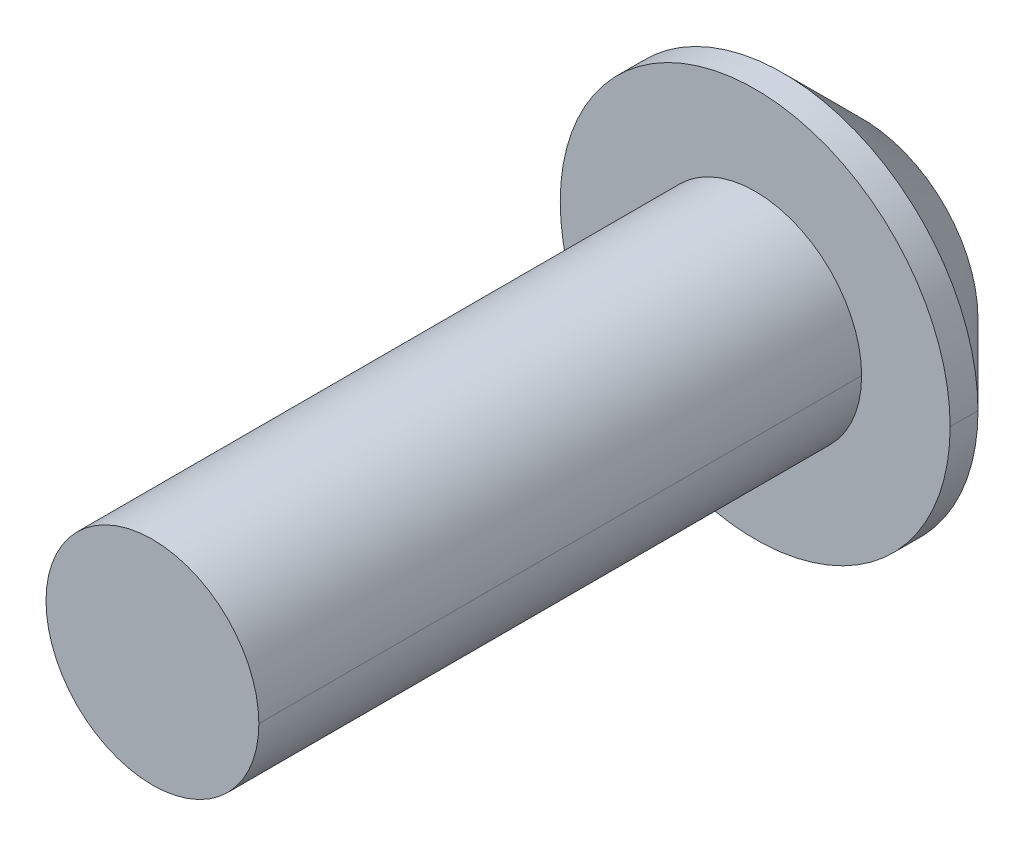
ISO-10303-21;
HEADER;
FILE_DESCRIPTION(('STEP AP214'),'2;1');
FILE_NAME('part.step','',(''),(''),'','','');
FILE_SCHEMA(('AUTOMOTIVE_DESIGN { 1 0 10303 214 1 1 1 1 }'));
ENDSEC;
DATA;
#1=APPLICATION_CONTEXT('core data for automotive mechanical design processes');
#2=APPLICATION_PROTOCOL_DEFINITION('international standard','automotive_design',2000,#1);
#3=PRODUCT_CONTEXT('',#1,'mechanical');
#4=PRODUCT('Part','Part','',(#3));
#5=PRODUCT_RELATED_PRODUCT_CATEGORY('part','',(#4));
#6=PRODUCT_DEFINITION_FORMATION('','',#4);
#7=PRODUCT_DEFINITION_CONTEXT('part definition',#1,'design');
#8=PRODUCT_DEFINITION('design','',#6,#7);
#9=PRODUCT_DEFINITION_SHAPE('','',#8);
#10=(LENGTH_UNIT() NAMED_UNIT(*) SI_UNIT(.MILLI.,.METRE.));
#11=(NAMED_UNIT(*) PLANE_ANGLE_UNIT() SI_UNIT($,.RADIAN.));
#12=(NAMED_UNIT(*) SI_UNIT($,.STERADIAN.) SOLID_ANGLE_UNIT());
#13=UNCERTAINTY_MEASURE_WITH_UNIT(LENGTH_MEASURE(1.E-05),#10,'distance_accuracy_value','');
#14=(GEOMETRIC_REPRESENTATION_CONTEXT(3) GLOBAL_UNCERTAINTY_ASSIGNED_CONTEXT((#13)) GLOBAL_UNIT_ASSIGNED_CONTEXT((#10,
#11,#12)) REPRESENTATION_CONTEXT('',''));
#15=CARTESIAN_POINT('',(0.,0.,0.));
#16=DIRECTION('',(0.,0.,1.));
#17=DIRECTION('',(1.,0.,0.));
#18=AXIS2_PLACEMENT_3D('',#15,#16,#17);
#19=CARTESIAN_POINT('',(0.,0.,9.15));
#20=DIRECTION('',(0.,0.,1.));
#21=DIRECTION('',(-1.,0.,0.));
#22=AXIS2_PLACEMENT_3D('',#19,#20,#21);
#23=CYLINDRICAL_SURFACE('',#22,5.35);
#24=DIRECTION('',(0.,0.,1.));
#25=VECTOR('',#24,1.);
#26=CARTESIAN_POINT('',(5.35,0.,9.15));
#27=LINE('',#26,#25);
#28=CARTESIAN_POINT('',(5.35,0.,-6.));
#29=VERTEX_POINT('',#28);
#30=CARTESIAN_POINT('',(5.35,0.,24.3));
#31=VERTEX_POINT('',#30);
#32=EDGE_CURVE('E114',#29,#31,#27,.T.);
#33=ORIENTED_EDGE('',*,*,#32,.F.);
#34=CARTESIAN_POINT('',(0.,0.,-6.));
#35=DIRECTION('',(0.,0.,1.));
#36=DIRECTION('',(-1.,0.,0.));
#37=AXIS2_PLACEMENT_3D('',#34,#35,#36);
#38=CIRCLE('',#37,5.35);
#39=CARTESIAN_POINT('',(-5.35,0.,-6.));
#40=VERTEX_POINT('',#39);
#41=EDGE_CURVE('E10',#29,#40,#38,.T.);
#42=ORIENTED_EDGE('',*,*,#41,.T.);
#43=DIRECTION('',(0.,0.,1.));
#44=VECTOR('',#43,1.);
#45=CARTESIAN_POINT('',(-5.35,0.,9.15));
#46=LINE('',#45,#44);
#47=CARTESIAN_POINT('',(-5.35,0.,24.3));
#48=VERTEX_POINT('',#47);
#49=EDGE_CURVE('E101',#40,#48,#46,.T.);
#50=ORIENTED_EDGE('',*,*,#49,.T.);
#51=CARTESIAN_POINT('',(0.,0.,24.3));
#52=DIRECTION('',(0.,0.,-1.));
#53=DIRECTION('',(-1.,0.,0.));
#54=AXIS2_PLACEMENT_3D('',#51,#52,#53);
#55=CIRCLE('',#54,5.35);
#56=EDGE_CURVE('E27',#48,#31,#55,.T.);
#57=ORIENTED_EDGE('',*,*,#56,.T.);
#58=EDGE_LOOP('',(#33,#42,#50,#57));
#59=FACE_BOUND('',#58,.T.);
#60=ADVANCED_FACE('F16',(#59),#23,.T.);
#61=CARTESIAN_POINT('',(-4.9,0.,-6.));
#62=DIRECTION('',(0.,0.,1.));
#63=DIRECTION('',(1.,0.,0.));
#64=AXIS2_PLACEMENT_3D('',#61,#62,#63);
#65=PLANE('',#64);
#66=CARTESIAN_POINT('',(0.,0.,-6.));
#67=DIRECTION('',(0.,0.,1.));
#68=DIRECTION('',(-1.,0.,0.));
#69=AXIS2_PLACEMENT_3D('',#66,#67,#68);
#70=CIRCLE('',#69,5.35);
#71=EDGE_CURVE('E120',#40,#29,#70,.T.);
#72=ORIENTED_EDGE('',*,*,#71,.F.);
#73=ORIENTED_EDGE('',*,*,#41,.F.);
#74=EDGE_LOOP('',(#72,#73));
#75=FACE_BOUND('',#74,.T.);
#76=CARTESIAN_POINT('',(0.,0.,-6.));
#77=DIRECTION('',(0.,0.,1.));
#78=DIRECTION('',(-1.,0.,0.));
#79=AXIS2_PLACEMENT_3D('',#76,#77,#78);
#80=CIRCLE('',#79,9.8);
#81=CARTESIAN_POINT('',(-9.8,0.,-6.));
#82=VERTEX_POINT('',#81);
#83=CARTESIAN_POINT('',(9.8,0.,-6.));
#84=VERTEX_POINT('',#83);
#85=EDGE_CURVE('E20',#82,#84,#80,.T.);
#86=ORIENTED_EDGE('',*,*,#85,.T.);
#87=CARTESIAN_POINT('',(0.,0.,-6.));
#88=DIRECTION('',(0.,0.,1.));
#89=DIRECTION('',(-1.,0.,0.));
#90=AXIS2_PLACEMENT_3D('',#87,#88,#89);
#91=CIRCLE('',#90,9.8);
#92=EDGE_CURVE('E75',#84,#82,#91,.T.);
#93=ORIENTED_EDGE('',*,*,#92,.T.);
#94=EDGE_LOOP('',(#86,#93));
#95=FACE_BOUND('',#94,.T.);
#96=ADVANCED_FACE('F18',(#75,#95),#65,.T.);
#97=CARTESIAN_POINT('',(0.,0.,24.3));
#98=DIRECTION('',(0.,0.,1.));
#99=DIRECTION('',(1.,0.,0.));
#100=AXIS2_PLACEMENT_3D('',#97,#98,#99);
#101=PLANE('',#100);
#102=ORIENTED_EDGE('',*,*,#56,.F.);
#103=CARTESIAN_POINT('',(0.,0.,24.3));
#104=DIRECTION('',(0.,0.,-1.));
#105=DIRECTION('',(-1.,0.,0.));
#106=AXIS2_PLACEMENT_3D('',#103,#104,#105);
#107=CIRCLE('',#106,5.35);
#108=EDGE_CURVE('E110',#31,#48,#107,.T.);
#109=ORIENTED_EDGE('',*,*,#108,.F.);
#110=EDGE_LOOP('',(#102,#109));
#111=FACE_BOUND('',#110,.T.);
#112=ADVANCED_FACE('F159',(#111),#101,.T.);
#113=CARTESIAN_POINT('',(0.,0.,-6.70000000000452));
#114=DIRECTION('',(0.,0.,1.));
#115=DIRECTION('',(-1.,0.,0.));
#116=AXIS2_PLACEMENT_3D('',#113,#114,#115);
#117=CYLINDRICAL_SURFACE('',#116,9.8);
#118=DIRECTION('',(0.,0.,1.));
#119=VECTOR('',#118,1.);
#120=CARTESIAN_POINT('',(9.8,0.,-6.70000000000452));
#121=LINE('',#120,#119);
#122=CARTESIAN_POINT('',(9.8,0.,-7.40000000000904));
#123=VERTEX_POINT('',#122);
#124=EDGE_CURVE('E90',#123,#84,#121,.T.);
#125=ORIENTED_EDGE('',*,*,#124,.F.);
#126=CARTESIAN_POINT('',(0.,0.,-7.40000000000904));
#127=DIRECTION('',(0.,0.,1.));
#128=DIRECTION('',(-1.,0.,0.));
#129=AXIS2_PLACEMENT_3D('',#126,#127,#128);
#130=CIRCLE('',#129,9.8);
#131=CARTESIAN_POINT('',(-9.8,0.,-7.40000000000904));
#132=VERTEX_POINT('',#131);
#133=EDGE_CURVE('E54',#123,#132,#130,.T.);
#134=ORIENTED_EDGE('',*,*,#133,.T.);
#135=DIRECTION('',(0.,0.,1.));
#136=VECTOR('',#135,1.);
#137=CARTESIAN_POINT('',(-9.8,0.,-6.70000000000452));
#138=LINE('',#137,#136);
#139=EDGE_CURVE('E81',#132,#82,#138,.T.);
#140=ORIENTED_EDGE('',*,*,#139,.T.);
#141=ORIENTED_EDGE('',*,*,#92,.F.);
#142=EDGE_LOOP('',(#125,#134,#140,#141));
#143=FACE_BOUND('',#142,.T.);
#144=ADVANCED_FACE('F82',(#143),#117,.T.);
#145=CARTESIAN_POINT('',(0.,0.,-7.40000000000905));
#146=DIRECTION('',(0.,0.,1.));
#147=DIRECTION('',(-1.,0.,0.));
#148=AXIS2_PLACEMENT_3D('',#145,#146,#147);
#149=CONICAL_SURFACE('',#148,9.8,0.78539816339745);
#150=DIRECTION('',(0.707106781186549,0.,0.707106781186546));
#151=VECTOR('',#150,1.);
#152=CARTESIAN_POINT('',(9.8,0.,-7.40000000000905));
#153=LINE('',#152,#151);
#154=CARTESIAN_POINT('',(5.80000000001158,0.,-11.3999999999974));
#155=VERTEX_POINT('',#154);
#156=EDGE_CURVE('E105',#155,#123,#153,.T.);
#157=ORIENTED_EDGE('',*,*,#156,.F.);
#158=CARTESIAN_POINT('',(0.,0.,-11.3999999999974));
#159=DIRECTION('',(0.,0.,1.));
#160=DIRECTION('',(-1.,0.,0.));
#161=AXIS2_PLACEMENT_3D('',#158,#159,#160);
#162=CIRCLE('',#161,5.80000000001158);
#163=CARTESIAN_POINT('',(-5.80000000001158,0.,-11.3999999999974));
#164=VERTEX_POINT('',#163);
#165=EDGE_CURVE('E40',#155,#164,#162,.T.);
#166=ORIENTED_EDGE('',*,*,#165,.T.);
#167=DIRECTION('',(-0.707106781186549,0.,0.707106781186546));
#168=VECTOR('',#167,1.);
#169=CARTESIAN_POINT('',(-9.8,0.,-7.40000000000905));
#170=LINE('',#169,#168);
#171=EDGE_CURVE('E106',#164,#132,#170,.T.);
#172=ORIENTED_EDGE('',*,*,#171,.T.);
#173=ORIENTED_EDGE('',*,*,#133,.F.);
#174=EDGE_LOOP('',(#157,#166,#172,#173));
#175=FACE_BOUND('',#174,.T.);
#176=ADVANCED_FACE('F144',(#175),#149,.T.);
#177=CARTESIAN_POINT('',(-2.90000000001157,0.,-11.3999999999974));
#178=DIRECTION('',(0.,0.,-1.));
#179=DIRECTION('',(0.,-1.,0.));
#180=AXIS2_PLACEMENT_3D('',#177,#178,#179);
#181=PLANE('',#180);
#182=CARTESIAN_POINT('',(0.,0.,-11.3999999999974));
#183=DIRECTION('',(0.,0.,1.));
#184=DIRECTION('',(-1.,0.,0.));
#185=AXIS2_PLACEMENT_3D('',#182,#183,#184);
#186=CIRCLE('',#185,5.80000000001158);
#187=EDGE_CURVE('E87',#164,#155,#186,.T.);
#188=ORIENTED_EDGE('',*,*,#187,.F.);
#189=ORIENTED_EDGE('',*,*,#165,.F.);
#190=EDGE_LOOP('',(#188,#189));
#191=FACE_BOUND('',#190,.T.);
#192=ADVANCED_FACE('F142',(#191),#181,.T.);
#193=CARTESIAN_POINT('',(0.,0.,-7.40000000000905));
#194=DIRECTION('',(0.,0.,1.));
#195=DIRECTION('',(-1.,0.,0.));
#196=AXIS2_PLACEMENT_3D('',#193,#194,#195);
#197=CONICAL_SURFACE('',#196,9.8,0.78539816339745);
#198=ORIENTED_EDGE('',*,*,#187,.T.);
#199=ORIENTED_EDGE('',*,*,#156,.T.);
#200=CARTESIAN_POINT('',(0.,0.,-7.40000000000904));
#201=DIRECTION('',(0.,0.,1.));
#202=DIRECTION('',(-1.,0.,0.));
#203=AXIS2_PLACEMENT_3D('',#200,#201,#202);
#204=CIRCLE('',#203,9.8);
#205=EDGE_CURVE('E96',#132,#123,#204,.T.);
#206=ORIENTED_EDGE('',*,*,#205,.F.);
#207=ORIENTED_EDGE('',*,*,#171,.F.);
#208=EDGE_LOOP('',(#198,#199,#206,#207));
#209=FACE_BOUND('',#208,.T.);
#210=ADVANCED_FACE('F141',(#209),#197,.T.);
#211=CARTESIAN_POINT('',(0.,0.,-6.70000000000452));
#212=DIRECTION('',(0.,0.,1.));
#213=DIRECTION('',(-1.,0.,0.));
#214=AXIS2_PLACEMENT_3D('',#211,#212,#213);
#215=CYLINDRICAL_SURFACE('',#214,9.8);
#216=ORIENTED_EDGE('',*,*,#205,.T.);
#217=ORIENTED_EDGE('',*,*,#124,.T.);
#218=ORIENTED_EDGE('',*,*,#85,.F.);
#219=ORIENTED_EDGE('',*,*,#139,.F.);
#220=EDGE_LOOP('',(#216,#217,#218,#219));
#221=FACE_BOUND('',#220,.T.);
#222=ADVANCED_FACE('F89',(#221),#215,.T.);
#223=CARTESIAN_POINT('',(0.,0.,9.15));
#224=DIRECTION('',(0.,0.,1.));
#225=DIRECTION('',(-1.,0.,0.));
#226=AXIS2_PLACEMENT_3D('',#223,#224,#225);
#227=CYLINDRICAL_SURFACE('',#226,5.35);
#228=ORIENTED_EDGE('',*,*,#71,.T.);
#229=ORIENTED_EDGE('',*,*,#32,.T.);
#230=ORIENTED_EDGE('',*,*,#108,.T.);
#231=ORIENTED_EDGE('',*,*,#49,.F.);
#232=EDGE_LOOP('',(#228,#229,#230,#231));
#233=FACE_BOUND('',#232,.T.);
#234=ADVANCED_FACE('F171',(#233),#227,.T.);
#235=CLOSED_SHELL('',(#60,#96,#112,#144,#176,#192,#210,#222,#234));
#236=MANIFOLD_SOLID_BREP('B1',#235);
#237=ADVANCED_BREP_SHAPE_REPRESENTATION('',(#18,#236),#14);
#238=SHAPE_DEFINITION_REPRESENTATION(#9,#237);
ENDSEC;
END-ISO-10303-21;
